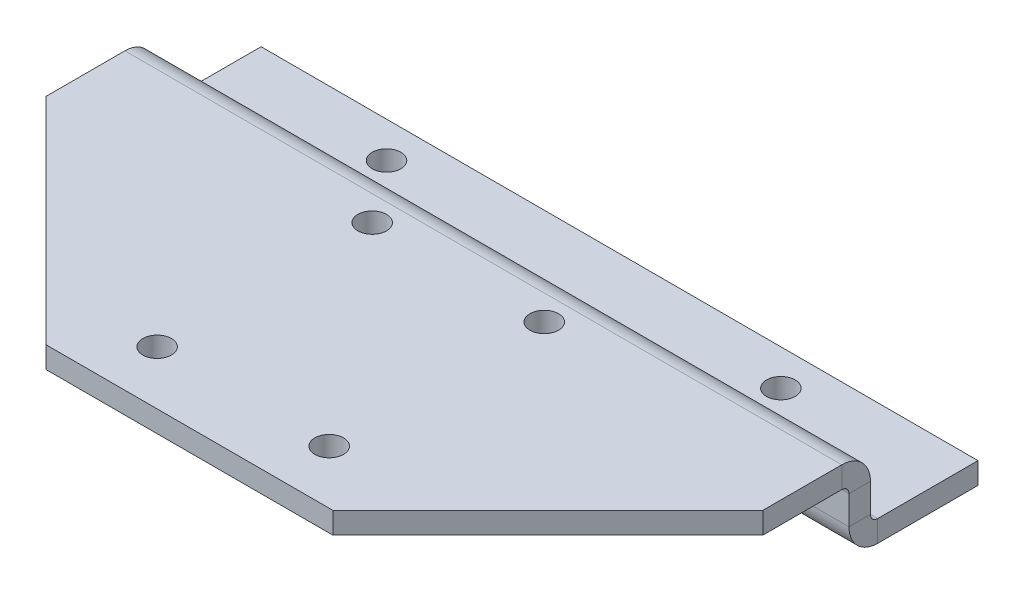
ISO-10303-21;
HEADER;
FILE_DESCRIPTION(('STEP AP214'),'2;1');
FILE_NAME('part.step','',(''),(''),'','','');
FILE_SCHEMA(('AUTOMOTIVE_DESIGN { 1 0 10303 214 1 1 1 1 }'));
ENDSEC;
DATA;
#1=APPLICATION_CONTEXT('core data for automotive mechanical design processes');
#2=APPLICATION_PROTOCOL_DEFINITION('international standard','automotive_design',2000,#1);
#3=PRODUCT_CONTEXT('',#1,'mechanical');
#4=PRODUCT('Part','Part','',(#3));
#5=PRODUCT_RELATED_PRODUCT_CATEGORY('part','',(#4));
#6=PRODUCT_DEFINITION_FORMATION('','',#4);
#7=PRODUCT_DEFINITION_CONTEXT('part definition',#1,'design');
#8=PRODUCT_DEFINITION('design','',#6,#7);
#9=PRODUCT_DEFINITION_SHAPE('','',#8);
#10=(LENGTH_UNIT() NAMED_UNIT(*) SI_UNIT(.MILLI.,.METRE.));
#11=(NAMED_UNIT(*) PLANE_ANGLE_UNIT() SI_UNIT($,.RADIAN.));
#12=(NAMED_UNIT(*) SI_UNIT($,.STERADIAN.) SOLID_ANGLE_UNIT());
#13=UNCERTAINTY_MEASURE_WITH_UNIT(LENGTH_MEASURE(1.E-05),#10,'distance_accuracy_value','');
#14=(GEOMETRIC_REPRESENTATION_CONTEXT(3) GLOBAL_UNCERTAINTY_ASSIGNED_CONTEXT((#13)) GLOBAL_UNIT_ASSIGNED_CONTEXT((#10,
#11,#12)) REPRESENTATION_CONTEXT('',''));
#15=CARTESIAN_POINT('',(0.,0.,0.));
#16=DIRECTION('',(0.,0.,1.));
#17=DIRECTION('',(1.,0.,0.));
#18=AXIS2_PLACEMENT_3D('',#15,#16,#17);
#19=CARTESIAN_POINT('',(0.,-12.,0.));
#20=DIRECTION('',(0.,1.,0.));
#21=DIRECTION('',(0.,0.,1.));
#22=AXIS2_PLACEMENT_3D('',#19,#20,#21);
#23=PLANE('',#22);
#24=DIRECTION('',(-1.,0.,0.));
#25=VECTOR('',#24,1.);
#26=CARTESIAN_POINT('',(50.,-12.,-23.5));
#27=LINE('',#26,#25);
#28=CARTESIAN_POINT('',(-50.,-12.,-23.5));
#29=VERTEX_POINT('',#28);
#30=CARTESIAN_POINT('',(50.,-12.,-23.5));
#31=VERTEX_POINT('',#30);
#32=EDGE_CURVE('E221',#29,#31,#27,.F.);
#33=ORIENTED_EDGE('',*,*,#32,.F.);
#34=DIRECTION('',(0.,0.,-1.));
#35=VECTOR('',#34,1.);
#36=CARTESIAN_POINT('',(-50.,-12.,0.));
#37=LINE('',#36,#35);
#38=CARTESIAN_POINT('',(-50.,-12.,-37.5));
#39=VERTEX_POINT('',#38);
#40=EDGE_CURVE('E195',#29,#39,#37,.T.);
#41=ORIENTED_EDGE('',*,*,#40,.T.);
#42=DIRECTION('',(1.,0.,0.));
#43=VECTOR('',#42,1.);
#44=CARTESIAN_POINT('',(0.,-12.,-37.5));
#45=LINE('',#44,#43);
#46=CARTESIAN_POINT('',(50.,-12.,-37.5));
#47=VERTEX_POINT('',#46);
#48=EDGE_CURVE('E188',#39,#47,#45,.T.);
#49=ORIENTED_EDGE('',*,*,#48,.T.);
#50=DIRECTION('',(0.,0.,1.));
#51=VECTOR('',#50,1.);
#52=CARTESIAN_POINT('',(50.,-12.,0.));
#53=LINE('',#52,#51);
#54=EDGE_CURVE('E193',#47,#31,#53,.T.);
#55=ORIENTED_EDGE('',*,*,#54,.T.);
#56=EDGE_LOOP('',(#33,#41,#49,#55));
#57=FACE_BOUND('',#56,.T.);
#58=CARTESIAN_POINT('',(27.5,-12.,-32.5000000000001));
#59=DIRECTION('',(0.,1.,0.));
#60=DIRECTION('',(0.,0.,1.));
#61=AXIS2_PLACEMENT_3D('',#58,#59,#60);
#62=CIRCLE('',#61,2.00000000000001);
#63=CARTESIAN_POINT('',(27.5,-12.,-30.5000000000001));
#64=VERTEX_POINT('',#63);
#65=EDGE_CURVE('E390',#64,#64,#62,.F.);
#66=ORIENTED_EDGE('',*,*,#65,.F.);
#67=EDGE_LOOP('',(#66));
#68=FACE_BOUND('',#67,.T.);
#69=CARTESIAN_POINT('',(-27.5,-12.,-32.5000000000001));
#70=DIRECTION('',(0.,1.,0.));
#71=DIRECTION('',(0.,0.,1.));
#72=AXIS2_PLACEMENT_3D('',#69,#70,#71);
#73=CIRCLE('',#72,2.00000000000001);
#74=CARTESIAN_POINT('',(-27.5,-12.,-30.5000000000001));
#75=VERTEX_POINT('',#74);
#76=EDGE_CURVE('E229',#75,#75,#73,.T.);
#77=ORIENTED_EDGE('',*,*,#76,.T.);
#78=EDGE_LOOP('',(#77));
#79=FACE_BOUND('',#78,.T.);
#80=ADVANCED_FACE('F83',(#57,#68,#79),#23,.F.);
#81=CARTESIAN_POINT('',(0.,-9.,0.));
#82=DIRECTION('',(0.,1.,0.));
#83=DIRECTION('',(0.,0.,1.));
#84=AXIS2_PLACEMENT_3D('',#81,#82,#83);
#85=PLANE('',#84);
#86=CARTESIAN_POINT('',(27.5,-9.,-32.5000000000001));
#87=DIRECTION('',(0.,1.,0.));
#88=DIRECTION('',(0.,0.,1.));
#89=AXIS2_PLACEMENT_3D('',#86,#87,#88);
#90=CIRCLE('',#89,2.00000000000001);
#91=CARTESIAN_POINT('',(27.5,-9.,-30.5000000000001));
#92=VERTEX_POINT('',#91);
#93=EDGE_CURVE('E387',#92,#92,#90,.F.);
#94=ORIENTED_EDGE('',*,*,#93,.T.);
#95=EDGE_LOOP('',(#94));
#96=FACE_BOUND('',#95,.T.);
#97=DIRECTION('',(0.,0.,1.));
#98=VECTOR('',#97,1.);
#99=CARTESIAN_POINT('',(-50.,-9.,-37.5));
#100=LINE('',#99,#98);
#101=CARTESIAN_POINT('',(-50.,-9.,-23.5));
#102=VERTEX_POINT('',#101);
#103=CARTESIAN_POINT('',(-50.,-9.,-37.5));
#104=VERTEX_POINT('',#103);
#105=EDGE_CURVE('E215',#102,#104,#100,.F.);
#106=ORIENTED_EDGE('',*,*,#105,.F.);
#107=DIRECTION('',(-1.,0.,0.));
#108=VECTOR('',#107,1.);
#109=CARTESIAN_POINT('',(50.,-9.,-23.5));
#110=LINE('',#109,#108);
#111=CARTESIAN_POINT('',(50.,-9.,-23.5));
#112=VERTEX_POINT('',#111);
#113=EDGE_CURVE('E226',#112,#102,#110,.T.);
#114=ORIENTED_EDGE('',*,*,#113,.F.);
#115=DIRECTION('',(0.,0.,-1.));
#116=VECTOR('',#115,1.);
#117=CARTESIAN_POINT('',(50.,-9.,-22.5));
#118=LINE('',#117,#116);
#119=CARTESIAN_POINT('',(50.,-9.,-37.5));
#120=VERTEX_POINT('',#119);
#121=EDGE_CURVE('E219',#120,#112,#118,.F.);
#122=ORIENTED_EDGE('',*,*,#121,.F.);
#123=DIRECTION('',(-1.,0.,0.));
#124=VECTOR('',#123,1.);
#125=CARTESIAN_POINT('',(50.,-9.,-37.5));
#126=LINE('',#125,#124);
#127=EDGE_CURVE('E204',#104,#120,#126,.F.);
#128=ORIENTED_EDGE('',*,*,#127,.F.);
#129=EDGE_LOOP('',(#106,#114,#122,#128));
#130=FACE_BOUND('',#129,.T.);
#131=CARTESIAN_POINT('',(-27.5,-9.,-32.5000000000001));
#132=DIRECTION('',(0.,1.,0.));
#133=DIRECTION('',(0.,0.,1.));
#134=AXIS2_PLACEMENT_3D('',#131,#132,#133);
#135=CIRCLE('',#134,2.00000000000001);
#136=CARTESIAN_POINT('',(-27.5,-9.,-30.5000000000001));
#137=VERTEX_POINT('',#136);
#138=EDGE_CURVE('E394',#137,#137,#135,.T.);
#139=ORIENTED_EDGE('',*,*,#138,.F.);
#140=EDGE_LOOP('',(#139));
#141=FACE_BOUND('',#140,.T.);
#142=ADVANCED_FACE('F381',(#96,#130,#141),#85,.T.);
#143=CARTESIAN_POINT('',(50.,-12.,-22.5));
#144=DIRECTION('',(-1.,0.,0.));
#145=DIRECTION('',(0.,0.,1.));
#146=AXIS2_PLACEMENT_3D('',#143,#144,#145);
#147=PLANE('',#146);
#148=DIRECTION('',(0.,0.,1.));
#149=VECTOR('',#148,1.);
#150=CARTESIAN_POINT('',(50.,-8.,-22.5));
#151=LINE('',#150,#149);
#152=CARTESIAN_POINT('',(50.,-8.,-22.5));
#153=VERTEX_POINT('',#152);
#154=CARTESIAN_POINT('',(50.,-8.,-19.5));
#155=VERTEX_POINT('',#154);
#156=EDGE_CURVE('E248',#153,#155,#151,.T.);
#157=ORIENTED_EDGE('',*,*,#156,.F.);
#158=DIRECTION('',(0.,-1.,0.));
#159=VECTOR('',#158,1.);
#160=CARTESIAN_POINT('',(50.,0.,-22.5));
#161=LINE('',#160,#159);
#162=CARTESIAN_POINT('',(50.,-3.99999999999998,-22.5));
#163=VERTEX_POINT('',#162);
#164=EDGE_CURVE('E257',#163,#153,#161,.T.);
#165=ORIENTED_EDGE('',*,*,#164,.F.);
#166=DIRECTION('',(0.,0.,1.));
#167=VECTOR('',#166,1.);
#168=CARTESIAN_POINT('',(50.,-4.,-19.5));
#169=LINE('',#168,#167);
#170=CARTESIAN_POINT('',(50.,-4.,-19.5));
#171=VERTEX_POINT('',#170);
#172=EDGE_CURVE('E268',#171,#163,#169,.F.);
#173=ORIENTED_EDGE('',*,*,#172,.F.);
#174=DIRECTION('',(0.,1.,0.));
#175=VECTOR('',#174,1.);
#176=CARTESIAN_POINT('',(50.,-12.,-19.5));
#177=LINE('',#176,#175);
#178=EDGE_CURVE('E262',#171,#155,#177,.F.);
#179=ORIENTED_EDGE('',*,*,#178,.T.);
#180=EDGE_LOOP('',(#157,#165,#173,#179));
#181=FACE_BOUND('',#180,.T.);
#182=ADVANCED_FACE('F363',(#181),#147,.F.);
#183=CARTESIAN_POINT('',(-50.,-2.99999999999999,-22.5));
#184=DIRECTION('',(1.,0.,0.));
#185=DIRECTION('',(0.,0.,-1.));
#186=AXIS2_PLACEMENT_3D('',#183,#184,#185);
#187=PLANE('',#186);
#188=DIRECTION('',(0.,0.,1.));
#189=VECTOR('',#188,1.);
#190=CARTESIAN_POINT('',(-50.,-8.,-22.5));
#191=LINE('',#190,#189);
#192=CARTESIAN_POINT('',(-50.,-8.,-22.5));
#193=VERTEX_POINT('',#192);
#194=CARTESIAN_POINT('',(-50.,-8.00000000000001,-19.5));
#195=VERTEX_POINT('',#194);
#196=EDGE_CURVE('E237',#193,#195,#191,.T.);
#197=ORIENTED_EDGE('',*,*,#196,.T.);
#198=DIRECTION('',(0.,-1.,0.));
#199=VECTOR('',#198,1.);
#200=CARTESIAN_POINT('',(-50.,-3.,-19.5));
#201=LINE('',#200,#199);
#202=CARTESIAN_POINT('',(-50.,-4.,-19.5));
#203=VERTEX_POINT('',#202);
#204=EDGE_CURVE('E260',#195,#203,#201,.F.);
#205=ORIENTED_EDGE('',*,*,#204,.T.);
#206=DIRECTION('',(0.,0.,1.));
#207=VECTOR('',#206,1.);
#208=CARTESIAN_POINT('',(-50.,-3.99999999999998,-22.5));
#209=LINE('',#208,#207);
#210=CARTESIAN_POINT('',(-50.,-3.99999999999999,-22.5));
#211=VERTEX_POINT('',#210);
#212=EDGE_CURVE('E251',#203,#211,#209,.F.);
#213=ORIENTED_EDGE('',*,*,#212,.T.);
#214=DIRECTION('',(0.,1.,0.));
#215=VECTOR('',#214,1.);
#216=CARTESIAN_POINT('',(-50.,0.,-22.5));
#217=LINE('',#216,#215);
#218=EDGE_CURVE('E254',#193,#211,#217,.T.);
#219=ORIENTED_EDGE('',*,*,#218,.F.);
#220=EDGE_LOOP('',(#197,#205,#213,#219));
#221=FACE_BOUND('',#220,.T.);
#222=ADVANCED_FACE('F370',(#221),#187,.F.);
#223=CARTESIAN_POINT('',(0.,0.,-22.5));
#224=DIRECTION('',(0.,0.,1.));
#225=DIRECTION('',(0.,-1.,0.));
#226=AXIS2_PLACEMENT_3D('',#223,#224,#225);
#227=PLANE('',#226);
#228=DIRECTION('',(-1.,0.,0.));
#229=VECTOR('',#228,1.);
#230=CARTESIAN_POINT('',(-50.,-8.,-22.5));
#231=LINE('',#230,#229);
#232=EDGE_CURVE('E243',#193,#153,#231,.F.);
#233=ORIENTED_EDGE('',*,*,#232,.F.);
#234=ORIENTED_EDGE('',*,*,#218,.T.);
#235=DIRECTION('',(1.,0.,0.));
#236=VECTOR('',#235,1.);
#237=CARTESIAN_POINT('',(-50.,-3.99999999999998,-22.5));
#238=LINE('',#237,#236);
#239=EDGE_CURVE('E265',#163,#211,#238,.F.);
#240=ORIENTED_EDGE('',*,*,#239,.F.);
#241=ORIENTED_EDGE('',*,*,#164,.T.);
#242=EDGE_LOOP('',(#233,#234,#240,#241));
#243=FACE_BOUND('',#242,.T.);
#244=ADVANCED_FACE('F367',(#243),#227,.F.);
#245=CARTESIAN_POINT('',(0.,0.,-19.5));
#246=DIRECTION('',(0.,0.,1.));
#247=DIRECTION('',(0.,-1.,0.));
#248=AXIS2_PLACEMENT_3D('',#245,#246,#247);
#249=PLANE('',#248);
#250=ORIENTED_EDGE('',*,*,#204,.F.);
#251=DIRECTION('',(-1.,0.,0.));
#252=VECTOR('',#251,1.);
#253=CARTESIAN_POINT('',(-50.,-8.00000000000001,-19.5));
#254=LINE('',#253,#252);
#255=EDGE_CURVE('E230',#195,#155,#254,.F.);
#256=ORIENTED_EDGE('',*,*,#255,.T.);
#257=ORIENTED_EDGE('',*,*,#178,.F.);
#258=DIRECTION('',(1.,0.,0.));
#259=VECTOR('',#258,1.);
#260=CARTESIAN_POINT('',(-50.,-4.,-19.5));
#261=LINE('',#260,#259);
#262=EDGE_CURVE('E271',#203,#171,#261,.T.);
#263=ORIENTED_EDGE('',*,*,#262,.F.);
#264=EDGE_LOOP('',(#250,#256,#257,#263));
#265=FACE_BOUND('',#264,.T.);
#266=ADVANCED_FACE('F360',(#265),#249,.T.);
#267=CARTESIAN_POINT('',(50.,-3.,-22.5));
#268=DIRECTION('',(1.,0.,0.));
#269=DIRECTION('',(0.,0.,-1.));
#270=AXIS2_PLACEMENT_3D('',#267,#268,#269);
#271=PLANE('',#270);
#272=DIRECTION('',(0.,0.,-1.));
#273=VECTOR('',#272,1.);
#274=CARTESIAN_POINT('',(50.,0.,-22.5));
#275=LINE('',#274,#273);
#276=CARTESIAN_POINT('',(50.,0.,-7.50000000000009));
#277=VERTEX_POINT('',#276);
#278=CARTESIAN_POINT('',(50.,0.,-18.5));
#279=VERTEX_POINT('',#278);
#280=EDGE_CURVE('E295',#277,#279,#275,.T.);
#281=ORIENTED_EDGE('',*,*,#280,.F.);
#282=DIRECTION('',(0.,-1.,0.));
#283=VECTOR('',#282,1.);
#284=CARTESIAN_POINT('',(50.,-3.,-7.50000000000008));
#285=LINE('',#284,#283);
#286=CARTESIAN_POINT('',(50.,-3.,-7.50000000000009));
#287=VERTEX_POINT('',#286);
#288=EDGE_CURVE('E107',#277,#287,#285,.T.);
#289=ORIENTED_EDGE('',*,*,#288,.T.);
#290=DIRECTION('',(0.,0.,-1.));
#291=VECTOR('',#290,1.);
#292=CARTESIAN_POINT('',(50.,-3.,-22.5));
#293=LINE('',#292,#291);
#294=CARTESIAN_POINT('',(50.,-3.,-18.5));
#295=VERTEX_POINT('',#294);
#296=EDGE_CURVE('E298',#287,#295,#293,.T.);
#297=ORIENTED_EDGE('',*,*,#296,.T.);
#298=DIRECTION('',(0.,1.,0.));
#299=VECTOR('',#298,1.);
#300=CARTESIAN_POINT('',(50.,-3.,-18.5));
#301=LINE('',#300,#299);
#302=EDGE_CURVE('E282',#295,#279,#301,.T.);
#303=ORIENTED_EDGE('',*,*,#302,.T.);
#304=EDGE_LOOP('',(#281,#289,#297,#303));
#305=FACE_BOUND('',#304,.T.);
#306=ADVANCED_FACE('F335',(#305),#271,.T.);
#307=CARTESIAN_POINT('',(0.,-3.,0.));
#308=DIRECTION('',(0.,1.,0.));
#309=DIRECTION('',(0.,0.,1.));
#310=AXIS2_PLACEMENT_3D('',#307,#308,#309);
#311=PLANE('',#310);
#312=CARTESIAN_POINT('',(12.,-3.,-15.));
#313=DIRECTION('',(0.,1.,0.));
#314=DIRECTION('',(0.,0.,1.));
#315=AXIS2_PLACEMENT_3D('',#312,#313,#314);
#316=CIRCLE('',#315,2.);
#317=CARTESIAN_POINT('',(12.,-3.,-13.));
#318=VERTEX_POINT('',#317);
#319=EDGE_CURVE('E416',#318,#318,#316,.T.);
#320=ORIENTED_EDGE('',*,*,#319,.T.);
#321=EDGE_LOOP('',(#320));
#322=FACE_BOUND('',#321,.T.);
#323=CARTESIAN_POINT('',(12.,-3.,15.));
#324=DIRECTION('',(0.,1.,0.));
#325=DIRECTION('',(0.,0.,1.));
#326=AXIS2_PLACEMENT_3D('',#323,#324,#325);
#327=CIRCLE('',#326,2.);
#328=CARTESIAN_POINT('',(12.,-3.,17.));
#329=VERTEX_POINT('',#328);
#330=EDGE_CURVE('E410',#329,#329,#327,.T.);
#331=ORIENTED_EDGE('',*,*,#330,.T.);
#332=EDGE_LOOP('',(#331));
#333=FACE_BOUND('',#332,.T.);
#334=CARTESIAN_POINT('',(-12.,-3.,15.));
#335=DIRECTION('',(0.,1.,0.));
#336=DIRECTION('',(0.,0.,1.));
#337=AXIS2_PLACEMENT_3D('',#334,#335,#336);
#338=CIRCLE('',#337,2.);
#339=CARTESIAN_POINT('',(-12.,-3.,17.));
#340=VERTEX_POINT('',#339);
#341=EDGE_CURVE('E404',#340,#340,#338,.T.);
#342=ORIENTED_EDGE('',*,*,#341,.T.);
#343=EDGE_LOOP('',(#342));
#344=FACE_BOUND('',#343,.T.);
#345=CARTESIAN_POINT('',(-12.,-3.,-15.));
#346=DIRECTION('',(0.,1.,0.));
#347=DIRECTION('',(0.,0.,1.));
#348=AXIS2_PLACEMENT_3D('',#345,#346,#347);
#349=CIRCLE('',#348,2.);
#350=CARTESIAN_POINT('',(-12.,-3.,-13.));
#351=VERTEX_POINT('',#350);
#352=EDGE_CURVE('E391',#351,#351,#349,.T.);
#353=ORIENTED_EDGE('',*,*,#352,.T.);
#354=EDGE_LOOP('',(#353));
#355=FACE_BOUND('',#354,.T.);
#356=ORIENTED_EDGE('',*,*,#296,.F.);
#357=DIRECTION('',(0.707106781186546,0.,-0.707106781186549));
#358=VECTOR('',#357,1.);
#359=CARTESIAN_POINT('',(20.,-3.,22.5));
#360=LINE('',#359,#358);
#361=CARTESIAN_POINT('',(20.,-3.,22.5));
#362=VERTEX_POINT('',#361);
#363=EDGE_CURVE('E92',#287,#362,#360,.F.);
#364=ORIENTED_EDGE('',*,*,#363,.T.);
#365=DIRECTION('',(1.,0.,0.));
#366=VECTOR('',#365,1.);
#367=CARTESIAN_POINT('',(-50.,-3.,22.5));
#368=LINE('',#367,#366);
#369=CARTESIAN_POINT('',(-19.9999999999999,-3.,22.5));
#370=VERTEX_POINT('',#369);
#371=EDGE_CURVE('E303',#370,#362,#368,.T.);
#372=ORIENTED_EDGE('',*,*,#371,.F.);
#373=DIRECTION('',(0.707106781186549,0.,0.707106781186546));
#374=VECTOR('',#373,1.);
#375=CARTESIAN_POINT('',(-50.,-3.,-7.49999999999999));
#376=LINE('',#375,#374);
#377=CARTESIAN_POINT('',(-50.,-3.,-7.49999999999999));
#378=VERTEX_POINT('',#377);
#379=EDGE_CURVE('E99',#370,#378,#376,.F.);
#380=ORIENTED_EDGE('',*,*,#379,.T.);
#381=DIRECTION('',(0.,0.,1.));
#382=VECTOR('',#381,1.);
#383=CARTESIAN_POINT('',(-50.,-3.,-22.5));
#384=LINE('',#383,#382);
#385=CARTESIAN_POINT('',(-50.,-3.,-18.5));
#386=VERTEX_POINT('',#385);
#387=EDGE_CURVE('E300',#386,#378,#384,.T.);
#388=ORIENTED_EDGE('',*,*,#387,.F.);
#389=DIRECTION('',(1.,0.,0.));
#390=VECTOR('',#389,1.);
#391=CARTESIAN_POINT('',(50.,-3.,-18.5));
#392=LINE('',#391,#390);
#393=EDGE_CURVE('E288',#295,#386,#392,.F.);
#394=ORIENTED_EDGE('',*,*,#393,.F.);
#395=EDGE_LOOP('',(#356,#364,#372,#380,#388,#394));
#396=FACE_BOUND('',#395,.T.);
#397=ADVANCED_FACE('F323',(#322,#333,#344,#355,#396),#311,.F.);
#398=CARTESIAN_POINT('',(0.,0.,0.));
#399=DIRECTION('',(0.,1.,0.));
#400=DIRECTION('',(0.,0.,1.));
#401=AXIS2_PLACEMENT_3D('',#398,#399,#400);
#402=PLANE('',#401);
#403=CARTESIAN_POINT('',(12.,0.,-15.));
#404=DIRECTION('',(0.,1.,0.));
#405=DIRECTION('',(0.,0.,1.));
#406=AXIS2_PLACEMENT_3D('',#403,#404,#405);
#407=CIRCLE('',#406,2.);
#408=CARTESIAN_POINT('',(12.,0.,-13.));
#409=VERTEX_POINT('',#408);
#410=EDGE_CURVE('E419',#409,#409,#407,.T.);
#411=ORIENTED_EDGE('',*,*,#410,.F.);
#412=EDGE_LOOP('',(#411));
#413=FACE_BOUND('',#412,.T.);
#414=CARTESIAN_POINT('',(12.,0.,15.));
#415=DIRECTION('',(0.,1.,0.));
#416=DIRECTION('',(0.,0.,1.));
#417=AXIS2_PLACEMENT_3D('',#414,#415,#416);
#418=CIRCLE('',#417,2.);
#419=CARTESIAN_POINT('',(12.,0.,17.));
#420=VERTEX_POINT('',#419);
#421=EDGE_CURVE('E413',#420,#420,#418,.T.);
#422=ORIENTED_EDGE('',*,*,#421,.F.);
#423=EDGE_LOOP('',(#422));
#424=FACE_BOUND('',#423,.T.);
#425=CARTESIAN_POINT('',(-12.,0.,15.));
#426=DIRECTION('',(0.,1.,0.));
#427=DIRECTION('',(0.,0.,1.));
#428=AXIS2_PLACEMENT_3D('',#425,#426,#427);
#429=CIRCLE('',#428,2.);
#430=CARTESIAN_POINT('',(-12.,0.,17.));
#431=VERTEX_POINT('',#430);
#432=EDGE_CURVE('E407',#431,#431,#429,.T.);
#433=ORIENTED_EDGE('',*,*,#432,.F.);
#434=EDGE_LOOP('',(#433));
#435=FACE_BOUND('',#434,.T.);
#436=CARTESIAN_POINT('',(-12.,0.,-15.));
#437=DIRECTION('',(0.,1.,0.));
#438=DIRECTION('',(0.,0.,1.));
#439=AXIS2_PLACEMENT_3D('',#436,#437,#438);
#440=CIRCLE('',#439,2.);
#441=CARTESIAN_POINT('',(-12.,0.,-13.));
#442=VERTEX_POINT('',#441);
#443=EDGE_CURVE('E401',#442,#442,#440,.T.);
#444=ORIENTED_EDGE('',*,*,#443,.F.);
#445=EDGE_LOOP('',(#444));
#446=FACE_BOUND('',#445,.T.);
#447=DIRECTION('',(1.,0.,0.));
#448=VECTOR('',#447,1.);
#449=CARTESIAN_POINT('',(-50.,0.,22.5));
#450=LINE('',#449,#448);
#451=CARTESIAN_POINT('',(-19.9999999999999,0.,22.5));
#452=VERTEX_POINT('',#451);
#453=CARTESIAN_POINT('',(20.,0.,22.5));
#454=VERTEX_POINT('',#453);
#455=EDGE_CURVE('E301',#452,#454,#450,.T.);
#456=ORIENTED_EDGE('',*,*,#455,.T.);
#457=DIRECTION('',(-0.707106781186546,0.,0.707106781186549));
#458=VECTOR('',#457,1.);
#459=CARTESIAN_POINT('',(21.2500000000001,0.,21.25));
#460=LINE('',#459,#458);
#461=EDGE_CURVE('E319',#454,#277,#460,.F.);
#462=ORIENTED_EDGE('',*,*,#461,.T.);
#463=ORIENTED_EDGE('',*,*,#280,.T.);
#464=DIRECTION('',(1.,0.,0.));
#465=VECTOR('',#464,1.);
#466=CARTESIAN_POINT('',(50.,0.,-18.5));
#467=LINE('',#466,#465);
#468=CARTESIAN_POINT('',(-50.,0.,-18.5));
#469=VERTEX_POINT('',#468);
#470=EDGE_CURVE('E275',#279,#469,#467,.F.);
#471=ORIENTED_EDGE('',*,*,#470,.T.);
#472=DIRECTION('',(0.,0.,1.));
#473=VECTOR('',#472,1.);
#474=CARTESIAN_POINT('',(-50.,0.,-22.5));
#475=LINE('',#474,#473);
#476=CARTESIAN_POINT('',(-50.,0.,-7.49999999999999));
#477=VERTEX_POINT('',#476);
#478=EDGE_CURVE('E308',#469,#477,#475,.T.);
#479=ORIENTED_EDGE('',*,*,#478,.T.);
#480=DIRECTION('',(-0.707106781186549,0.,-0.707106781186546));
#481=VECTOR('',#480,1.);
#482=CARTESIAN_POINT('',(-21.2499999999999,0.,21.25));
#483=LINE('',#482,#481);
#484=EDGE_CURVE('E317',#477,#452,#483,.F.);
#485=ORIENTED_EDGE('',*,*,#484,.T.);
#486=EDGE_LOOP('',(#456,#462,#463,#471,#479,#485));
#487=FACE_BOUND('',#486,.T.);
#488=ADVANCED_FACE('F333',(#413,#424,#435,#446,#487),#402,.T.);
#489=CARTESIAN_POINT('',(-50.,-3.,22.5));
#490=DIRECTION('',(0.,0.,1.));
#491=DIRECTION('',(1.,0.,0.));
#492=AXIS2_PLACEMENT_3D('',#489,#490,#491);
#493=PLANE('',#492);
#494=ORIENTED_EDGE('',*,*,#371,.T.);
#495=DIRECTION('',(0.,1.,0.));
#496=VECTOR('',#495,1.);
#497=CARTESIAN_POINT('',(20.,-3.,22.5));
#498=LINE('',#497,#496);
#499=EDGE_CURVE('E314',#362,#454,#498,.T.);
#500=ORIENTED_EDGE('',*,*,#499,.T.);
#501=ORIENTED_EDGE('',*,*,#455,.F.);
#502=DIRECTION('',(0.,-1.,0.));
#503=VECTOR('',#502,1.);
#504=CARTESIAN_POINT('',(-19.9999999999999,-3.,22.5));
#505=LINE('',#504,#503);
#506=EDGE_CURVE('E306',#452,#370,#505,.T.);
#507=ORIENTED_EDGE('',*,*,#506,.T.);
#508=EDGE_LOOP('',(#494,#500,#501,#507));
#509=FACE_BOUND('',#508,.T.);
#510=ADVANCED_FACE('F328',(#509),#493,.T.);
#511=CARTESIAN_POINT('',(-50.,-3.,-22.5));
#512=DIRECTION('',(-1.,0.,0.));
#513=DIRECTION('',(0.,0.,1.));
#514=AXIS2_PLACEMENT_3D('',#511,#512,#513);
#515=PLANE('',#514);
#516=ORIENTED_EDGE('',*,*,#387,.T.);
#517=DIRECTION('',(0.,1.,0.));
#518=VECTOR('',#517,1.);
#519=CARTESIAN_POINT('',(-50.,-3.,-7.49999999999999));
#520=LINE('',#519,#518);
#521=EDGE_CURVE('E13',#378,#477,#520,.T.);
#522=ORIENTED_EDGE('',*,*,#521,.T.);
#523=ORIENTED_EDGE('',*,*,#478,.F.);
#524=DIRECTION('',(0.,1.,0.));
#525=VECTOR('',#524,1.);
#526=CARTESIAN_POINT('',(-50.,-3.,-18.5));
#527=LINE('',#526,#525);
#528=EDGE_CURVE('E292',#386,#469,#527,.T.);
#529=ORIENTED_EDGE('',*,*,#528,.F.);
#530=EDGE_LOOP('',(#516,#522,#523,#529));
#531=FACE_BOUND('',#530,.T.);
#532=ADVANCED_FACE('F348',(#531),#515,.T.);
#533=CARTESIAN_POINT('',(-50.,-4.00000000000001,-18.5));
#534=DIRECTION('',(-1.,0.,0.));
#535=DIRECTION('',(0.,0.,1.));
#536=AXIS2_PLACEMENT_3D('',#533,#534,#535);
#537=PLANE('',#536);
#538=ORIENTED_EDGE('',*,*,#212,.F.);
#539=CARTESIAN_POINT('',(-50.,-4.00000000000001,-18.5));
#540=DIRECTION('',(1.,0.,0.));
#541=DIRECTION('',(0.,0.,-1.));
#542=AXIS2_PLACEMENT_3D('',#539,#540,#541);
#543=CIRCLE('',#542,1.);
#544=EDGE_CURVE('E285',#386,#203,#543,.F.);
#545=ORIENTED_EDGE('',*,*,#544,.F.);
#546=ORIENTED_EDGE('',*,*,#528,.T.);
#547=CARTESIAN_POINT('',(-50.,-4.00000000000001,-18.5));
#548=DIRECTION('',(1.,0.,0.));
#549=DIRECTION('',(0.,0.,-1.));
#550=AXIS2_PLACEMENT_3D('',#547,#548,#549);
#551=CIRCLE('',#550,4.);
#552=EDGE_CURVE('E278',#469,#211,#551,.F.);
#553=ORIENTED_EDGE('',*,*,#552,.T.);
#554=EDGE_LOOP('',(#538,#545,#546,#553));
#555=FACE_BOUND('',#554,.T.);
#556=ADVANCED_FACE('F356',(#555),#537,.T.);
#557=CARTESIAN_POINT('',(50.,-4.00000000000001,-18.5));
#558=DIRECTION('',(-1.,0.,0.));
#559=DIRECTION('',(0.,0.,1.));
#560=AXIS2_PLACEMENT_3D('',#557,#558,#559);
#561=PLANE('',#560);
#562=CARTESIAN_POINT('',(50.,-4.00000000000001,-18.5));
#563=DIRECTION('',(1.,0.,0.));
#564=DIRECTION('',(0.,0.,-1.));
#565=AXIS2_PLACEMENT_3D('',#562,#563,#564);
#566=CIRCLE('',#565,1.);
#567=EDGE_CURVE('E256',#171,#295,#566,.T.);
#568=ORIENTED_EDGE('',*,*,#567,.F.);
#569=ORIENTED_EDGE('',*,*,#172,.T.);
#570=CARTESIAN_POINT('',(50.,-4.00000000000001,-18.5));
#571=DIRECTION('',(1.,0.,0.));
#572=DIRECTION('',(0.,0.,-1.));
#573=AXIS2_PLACEMENT_3D('',#570,#571,#572);
#574=CIRCLE('',#573,4.);
#575=EDGE_CURVE('E279',#163,#279,#574,.T.);
#576=ORIENTED_EDGE('',*,*,#575,.T.);
#577=ORIENTED_EDGE('',*,*,#302,.F.);
#578=EDGE_LOOP('',(#568,#569,#576,#577));
#579=FACE_BOUND('',#578,.T.);
#580=ADVANCED_FACE('F339',(#579),#561,.F.);
#581=CARTESIAN_POINT('',(50.,-4.00000000000001,-18.5));
#582=DIRECTION('',(1.,0.,0.));
#583=DIRECTION('',(0.,0.,-1.));
#584=AXIS2_PLACEMENT_3D('',#581,#582,#583);
#585=CYLINDRICAL_SURFACE('',#584,4.);
#586=ORIENTED_EDGE('',*,*,#470,.F.);
#587=ORIENTED_EDGE('',*,*,#575,.F.);
#588=ORIENTED_EDGE('',*,*,#239,.T.);
#589=ORIENTED_EDGE('',*,*,#552,.F.);
#590=EDGE_LOOP('',(#586,#587,#588,#589));
#591=FACE_BOUND('',#590,.T.);
#592=ADVANCED_FACE('F352',(#591),#585,.T.);
#593=CARTESIAN_POINT('',(50.,-4.00000000000001,-18.5));
#594=DIRECTION('',(1.,0.,0.));
#595=DIRECTION('',(0.,0.,-1.));
#596=AXIS2_PLACEMENT_3D('',#593,#594,#595);
#597=CYLINDRICAL_SURFACE('',#596,1.);
#598=ORIENTED_EDGE('',*,*,#393,.T.);
#599=ORIENTED_EDGE('',*,*,#544,.T.);
#600=ORIENTED_EDGE('',*,*,#262,.T.);
#601=ORIENTED_EDGE('',*,*,#567,.T.);
#602=EDGE_LOOP('',(#598,#599,#600,#601));
#603=FACE_BOUND('',#602,.T.);
#604=ADVANCED_FACE('F342',(#603),#597,.F.);
#605=CARTESIAN_POINT('',(50.,-8.,-23.5));
#606=DIRECTION('',(1.,0.,0.));
#607=DIRECTION('',(0.,0.,-1.));
#608=AXIS2_PLACEMENT_3D('',#605,#606,#607);
#609=PLANE('',#608);
#610=DIRECTION('',(0.,1.,0.));
#611=VECTOR('',#610,1.);
#612=CARTESIAN_POINT('',(50.,-12.,-23.5));
#613=LINE('',#612,#611);
#614=EDGE_CURVE('E212',#112,#31,#613,.F.);
#615=ORIENTED_EDGE('',*,*,#614,.F.);
#616=CARTESIAN_POINT('',(50.,-8.,-23.5));
#617=DIRECTION('',(-1.,0.,0.));
#618=DIRECTION('',(0.,0.,1.));
#619=AXIS2_PLACEMENT_3D('',#616,#617,#618);
#620=CIRCLE('',#619,1.);
#621=EDGE_CURVE('E240',#153,#112,#620,.F.);
#622=ORIENTED_EDGE('',*,*,#621,.F.);
#623=ORIENTED_EDGE('',*,*,#156,.T.);
#624=CARTESIAN_POINT('',(50.,-8.,-23.5));
#625=DIRECTION('',(-1.,0.,0.));
#626=DIRECTION('',(0.,0.,1.));
#627=AXIS2_PLACEMENT_3D('',#624,#625,#626);
#628=CIRCLE('',#627,4.);
#629=EDGE_CURVE('E233',#155,#31,#628,.F.);
#630=ORIENTED_EDGE('',*,*,#629,.T.);
#631=EDGE_LOOP('',(#615,#622,#623,#630));
#632=FACE_BOUND('',#631,.T.);
#633=ADVANCED_FACE('F475',(#632),#609,.T.);
#634=CARTESIAN_POINT('',(-50.,-8.,-23.5));
#635=DIRECTION('',(1.,0.,0.));
#636=DIRECTION('',(0.,0.,-1.));
#637=AXIS2_PLACEMENT_3D('',#634,#635,#636);
#638=PLANE('',#637);
#639=CARTESIAN_POINT('',(-50.,-8.,-23.5));
#640=DIRECTION('',(-1.,0.,0.));
#641=DIRECTION('',(0.,0.,1.));
#642=AXIS2_PLACEMENT_3D('',#639,#640,#641);
#643=CIRCLE('',#642,1.);
#644=EDGE_CURVE('E245',#102,#193,#643,.T.);
#645=ORIENTED_EDGE('',*,*,#644,.F.);
#646=DIRECTION('',(0.,1.,0.));
#647=VECTOR('',#646,1.);
#648=CARTESIAN_POINT('',(-50.,-9.,-23.5));
#649=LINE('',#648,#647);
#650=EDGE_CURVE('E223',#102,#29,#649,.F.);
#651=ORIENTED_EDGE('',*,*,#650,.T.);
#652=CARTESIAN_POINT('',(-50.,-8.,-23.5));
#653=DIRECTION('',(-1.,0.,0.));
#654=DIRECTION('',(0.,0.,1.));
#655=AXIS2_PLACEMENT_3D('',#652,#653,#654);
#656=CIRCLE('',#655,4.);
#657=EDGE_CURVE('E234',#29,#195,#656,.T.);
#658=ORIENTED_EDGE('',*,*,#657,.T.);
#659=ORIENTED_EDGE('',*,*,#196,.F.);
#660=EDGE_LOOP('',(#645,#651,#658,#659));
#661=FACE_BOUND('',#660,.T.);
#662=ADVANCED_FACE('F373',(#661),#638,.F.);
#663=CARTESIAN_POINT('',(-50.,-8.,-23.5));
#664=DIRECTION('',(-1.,0.,0.));
#665=DIRECTION('',(0.,-1.,0.));
#666=AXIS2_PLACEMENT_3D('',#663,#664,#665);
#667=CYLINDRICAL_SURFACE('',#666,4.);
#668=ORIENTED_EDGE('',*,*,#255,.F.);
#669=ORIENTED_EDGE('',*,*,#657,.F.);
#670=ORIENTED_EDGE('',*,*,#32,.T.);
#671=ORIENTED_EDGE('',*,*,#629,.F.);
#672=EDGE_LOOP('',(#668,#669,#670,#671));
#673=FACE_BOUND('',#672,.T.);
#674=ADVANCED_FACE('F469',(#673),#667,.T.);
#675=CARTESIAN_POINT('',(-50.,-8.,-23.5));
#676=DIRECTION('',(-1.,0.,0.));
#677=DIRECTION('',(0.,-1.,0.));
#678=AXIS2_PLACEMENT_3D('',#675,#676,#677);
#679=CYLINDRICAL_SURFACE('',#678,1.);
#680=ORIENTED_EDGE('',*,*,#232,.T.);
#681=ORIENTED_EDGE('',*,*,#621,.T.);
#682=ORIENTED_EDGE('',*,*,#113,.T.);
#683=ORIENTED_EDGE('',*,*,#644,.T.);
#684=EDGE_LOOP('',(#680,#681,#682,#683));
#685=FACE_BOUND('',#684,.T.);
#686=ADVANCED_FACE('F376',(#685),#679,.F.);
#687=CARTESIAN_POINT('',(50.,-12.,-22.5));
#688=DIRECTION('',(-1.,0.,0.));
#689=DIRECTION('',(0.,0.,1.));
#690=AXIS2_PLACEMENT_3D('',#687,#688,#689);
#691=PLANE('',#690);
#692=ORIENTED_EDGE('',*,*,#614,.T.);
#693=ORIENTED_EDGE('',*,*,#54,.F.);
#694=DIRECTION('',(0.,1.,0.));
#695=VECTOR('',#694,1.);
#696=CARTESIAN_POINT('',(50.,-12.,-37.5));
#697=LINE('',#696,#695);
#698=EDGE_CURVE('E199',#47,#120,#697,.T.);
#699=ORIENTED_EDGE('',*,*,#698,.T.);
#700=ORIENTED_EDGE('',*,*,#121,.T.);
#701=EDGE_LOOP('',(#692,#693,#699,#700));
#702=FACE_BOUND('',#701,.T.);
#703=ADVANCED_FACE('F211',(#702),#691,.F.);
#704=CARTESIAN_POINT('',(-50.,-12.,-37.5));
#705=DIRECTION('',(1.,0.,0.));
#706=DIRECTION('',(0.,0.,-1.));
#707=AXIS2_PLACEMENT_3D('',#704,#705,#706);
#708=PLANE('',#707);
#709=ORIENTED_EDGE('',*,*,#650,.F.);
#710=ORIENTED_EDGE('',*,*,#105,.T.);
#711=DIRECTION('',(0.,1.,0.));
#712=VECTOR('',#711,1.);
#713=CARTESIAN_POINT('',(-50.,-12.,-37.5));
#714=LINE('',#713,#712);
#715=EDGE_CURVE('E208',#39,#104,#714,.T.);
#716=ORIENTED_EDGE('',*,*,#715,.F.);
#717=ORIENTED_EDGE('',*,*,#40,.F.);
#718=EDGE_LOOP('',(#709,#710,#716,#717));
#719=FACE_BOUND('',#718,.T.);
#720=ADVANCED_FACE('F384',(#719),#708,.F.);
#721=CARTESIAN_POINT('',(50.,-12.,-37.5));
#722=DIRECTION('',(0.,0.,1.));
#723=DIRECTION('',(0.,-1.,0.));
#724=AXIS2_PLACEMENT_3D('',#721,#722,#723);
#725=PLANE('',#724);
#726=ORIENTED_EDGE('',*,*,#127,.T.);
#727=ORIENTED_EDGE('',*,*,#698,.F.);
#728=ORIENTED_EDGE('',*,*,#48,.F.);
#729=ORIENTED_EDGE('',*,*,#715,.T.);
#730=EDGE_LOOP('',(#726,#727,#728,#729));
#731=FACE_BOUND('',#730,.T.);
#732=ADVANCED_FACE('F202',(#731),#725,.F.);
#733=CARTESIAN_POINT('',(27.5,-12.,-32.5000000000001));
#734=DIRECTION('',(0.,1.,0.));
#735=DIRECTION('',(0.,0.,1.));
#736=AXIS2_PLACEMENT_3D('',#733,#734,#735);
#737=CYLINDRICAL_SURFACE('',#736,2.00000000000001);
#738=ORIENTED_EDGE('',*,*,#65,.T.);
#739=EDGE_LOOP('',(#738));
#740=FACE_BOUND('',#739,.T.);
#741=ORIENTED_EDGE('',*,*,#93,.F.);
#742=EDGE_LOOP('',(#741));
#743=FACE_BOUND('',#742,.T.);
#744=ADVANCED_FACE('F460',(#740,#743),#737,.F.);
#745=CARTESIAN_POINT('',(-27.5,-12.,-32.5000000000001));
#746=DIRECTION('',(0.,1.,0.));
#747=DIRECTION('',(0.,0.,1.));
#748=AXIS2_PLACEMENT_3D('',#745,#746,#747);
#749=CYLINDRICAL_SURFACE('',#748,2.00000000000001);
#750=ORIENTED_EDGE('',*,*,#76,.F.);
#751=EDGE_LOOP('',(#750));
#752=FACE_BOUND('',#751,.T.);
#753=ORIENTED_EDGE('',*,*,#138,.T.);
#754=EDGE_LOOP('',(#753));
#755=FACE_BOUND('',#754,.T.);
#756=ADVANCED_FACE('F439',(#752,#755),#749,.F.);
#757=CARTESIAN_POINT('',(-12.,0.,-15.));
#758=DIRECTION('',(0.,1.,0.));
#759=DIRECTION('',(0.,0.,1.));
#760=AXIS2_PLACEMENT_3D('',#757,#758,#759);
#761=CYLINDRICAL_SURFACE('',#760,2.);
#762=ORIENTED_EDGE('',*,*,#443,.T.);
#763=EDGE_LOOP('',(#762));
#764=FACE_BOUND('',#763,.T.);
#765=ORIENTED_EDGE('',*,*,#352,.F.);
#766=EDGE_LOOP('',(#765));
#767=FACE_BOUND('',#766,.T.);
#768=ADVANCED_FACE('F435',(#764,#767),#761,.F.);
#769=CARTESIAN_POINT('',(-12.,0.,15.));
#770=DIRECTION('',(0.,1.,0.));
#771=DIRECTION('',(0.,0.,1.));
#772=AXIS2_PLACEMENT_3D('',#769,#770,#771);
#773=CYLINDRICAL_SURFACE('',#772,2.);
#774=ORIENTED_EDGE('',*,*,#432,.T.);
#775=EDGE_LOOP('',(#774));
#776=FACE_BOUND('',#775,.T.);
#777=ORIENTED_EDGE('',*,*,#341,.F.);
#778=EDGE_LOOP('',(#777));
#779=FACE_BOUND('',#778,.T.);
#780=ADVANCED_FACE('F438',(#776,#779),#773,.F.);
#781=CARTESIAN_POINT('',(12.,0.,15.));
#782=DIRECTION('',(0.,1.,0.));
#783=DIRECTION('',(0.,0.,1.));
#784=AXIS2_PLACEMENT_3D('',#781,#782,#783);
#785=CYLINDRICAL_SURFACE('',#784,2.);
#786=ORIENTED_EDGE('',*,*,#421,.T.);
#787=EDGE_LOOP('',(#786));
#788=FACE_BOUND('',#787,.T.);
#789=ORIENTED_EDGE('',*,*,#330,.F.);
#790=EDGE_LOOP('',(#789));
#791=FACE_BOUND('',#790,.T.);
#792=ADVANCED_FACE('F561',(#788,#791),#785,.F.);
#793=CARTESIAN_POINT('',(12.,0.,-15.));
#794=DIRECTION('',(0.,1.,0.));
#795=DIRECTION('',(0.,0.,1.));
#796=AXIS2_PLACEMENT_3D('',#793,#794,#795);
#797=CYLINDRICAL_SURFACE('',#796,2.);
#798=ORIENTED_EDGE('',*,*,#410,.T.);
#799=EDGE_LOOP('',(#798));
#800=FACE_BOUND('',#799,.T.);
#801=ORIENTED_EDGE('',*,*,#319,.F.);
#802=EDGE_LOOP('',(#801));
#803=FACE_BOUND('',#802,.T.);
#804=ADVANCED_FACE('F423',(#800,#803),#797,.F.);
#805=CARTESIAN_POINT('',(20.,-3.,22.5));
#806=DIRECTION('',(-0.707106781186549,0.,-0.707106781186546));
#807=DIRECTION('',(0.,1.,0.));
#808=AXIS2_PLACEMENT_3D('',#805,#806,#807);
#809=PLANE('',#808);
#810=ORIENTED_EDGE('',*,*,#363,.F.);
#811=ORIENTED_EDGE('',*,*,#288,.F.);
#812=ORIENTED_EDGE('',*,*,#461,.F.);
#813=ORIENTED_EDGE('',*,*,#499,.F.);
#814=EDGE_LOOP('',(#810,#811,#812,#813));
#815=FACE_BOUND('',#814,.T.);
#816=ADVANCED_FACE('F331',(#815),#809,.F.);
#817=CARTESIAN_POINT('',(-50.,-3.,-7.49999999999999));
#818=DIRECTION('',(0.707106781186546,0.,-0.707106781186549));
#819=DIRECTION('',(0.,1.,0.));
#820=AXIS2_PLACEMENT_3D('',#817,#818,#819);
#821=PLANE('',#820);
#822=ORIENTED_EDGE('',*,*,#379,.F.);
#823=ORIENTED_EDGE('',*,*,#506,.F.);
#824=ORIENTED_EDGE('',*,*,#484,.F.);
#825=ORIENTED_EDGE('',*,*,#521,.F.);
#826=EDGE_LOOP('',(#822,#823,#824,#825));
#827=FACE_BOUND('',#826,.T.);
#828=ADVANCED_FACE('F86',(#827),#821,.F.);
#829=CLOSED_SHELL('',(#80,#142,#182,#222,#244,#266,#306,#397,#488,#510,#532,#556,#580,#592,#604,
#633,#662,#674,#686,#703,#720,#732,#744,#756,#768,#780,#792,#804,#816,#828));
#830=MANIFOLD_SOLID_BREP('B2',#829);
#831=ADVANCED_BREP_SHAPE_REPRESENTATION('',(#18,#830),#14);
#832=SHAPE_DEFINITION_REPRESENTATION(#9,#831);
ENDSEC;
END-ISO-10303-21;
